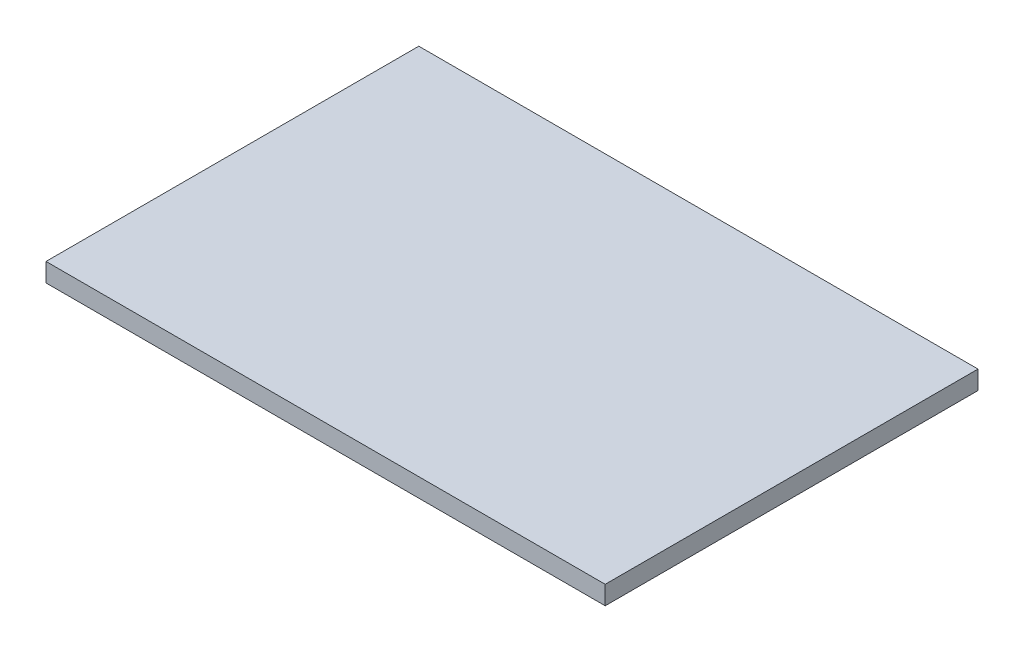
ISO-10303-21;
HEADER;
FILE_DESCRIPTION(('STEP AP214'),'2;1');
FILE_NAME('part.step','',(''),(''),'','','');
FILE_SCHEMA(('AUTOMOTIVE_DESIGN { 1 0 10303 214 1 1 1 1 }'));
ENDSEC;
DATA;
#1=APPLICATION_CONTEXT('core data for automotive mechanical design processes');
#2=APPLICATION_PROTOCOL_DEFINITION('international standard','automotive_design',2000,#1);
#3=PRODUCT_CONTEXT('',#1,'mechanical');
#4=PRODUCT('Part','Part','',(#3));
#5=PRODUCT_RELATED_PRODUCT_CATEGORY('part','',(#4));
#6=PRODUCT_DEFINITION_FORMATION('','',#4);
#7=PRODUCT_DEFINITION_CONTEXT('part definition',#1,'design');
#8=PRODUCT_DEFINITION('design','',#6,#7);
#9=PRODUCT_DEFINITION_SHAPE('','',#8);
#10=(LENGTH_UNIT() NAMED_UNIT(*) SI_UNIT(.MILLI.,.METRE.));
#11=(NAMED_UNIT(*) PLANE_ANGLE_UNIT() SI_UNIT($,.RADIAN.));
#12=(NAMED_UNIT(*) SI_UNIT($,.STERADIAN.) SOLID_ANGLE_UNIT());
#13=UNCERTAINTY_MEASURE_WITH_UNIT(LENGTH_MEASURE(1.E-05),#10,'distance_accuracy_value','');
#14=(GEOMETRIC_REPRESENTATION_CONTEXT(3) GLOBAL_UNCERTAINTY_ASSIGNED_CONTEXT((#13)) GLOBAL_UNIT_ASSIGNED_CONTEXT((#10,
#11,#12)) REPRESENTATION_CONTEXT('',''));
#15=CARTESIAN_POINT('',(0.,0.,0.));
#16=DIRECTION('',(0.,0.,1.));
#17=DIRECTION('',(1.,0.,0.));
#18=AXIS2_PLACEMENT_3D('',#15,#16,#17);
#19=CARTESIAN_POINT('',(0.,3.,0.));
#20=DIRECTION('',(1.,0.,0.));
#21=DIRECTION('',(0.,0.,-1.));
#22=AXIS2_PLACEMENT_3D('',#19,#20,#21);
#23=PLANE('',#22);
#24=DIRECTION('',(0.,0.,1.));
#25=VECTOR('',#24,1.);
#26=CARTESIAN_POINT('',(0.,0.,0.));
#27=LINE('',#26,#25);
#28=CARTESIAN_POINT('',(0.,0.,-60.));
#29=VERTEX_POINT('',#28);
#30=CARTESIAN_POINT('',(0.,0.,0.));
#31=VERTEX_POINT('',#30);
#32=EDGE_CURVE('E96',#29,#31,#27,.T.);
#33=ORIENTED_EDGE('',*,*,#32,.T.);
#34=DIRECTION('',(0.,-1.,0.));
#35=VECTOR('',#34,1.);
#36=CARTESIAN_POINT('',(0.,3.,0.));
#37=LINE('',#36,#35);
#38=CARTESIAN_POINT('',(0.,3.,0.));
#39=VERTEX_POINT('',#38);
#40=EDGE_CURVE('E11',#39,#31,#37,.T.);
#41=ORIENTED_EDGE('',*,*,#40,.F.);
#42=DIRECTION('',(0.,0.,1.));
#43=VECTOR('',#42,1.);
#44=CARTESIAN_POINT('',(0.,3.,0.));
#45=LINE('',#44,#43);
#46=CARTESIAN_POINT('',(0.,3.,-60.));
#47=VERTEX_POINT('',#46);
#48=EDGE_CURVE('E84',#47,#39,#45,.T.);
#49=ORIENTED_EDGE('',*,*,#48,.F.);
#50=DIRECTION('',(0.,-1.,0.));
#51=VECTOR('',#50,1.);
#52=CARTESIAN_POINT('',(0.,3.,-60.));
#53=LINE('',#52,#51);
#54=EDGE_CURVE('E92',#47,#29,#53,.T.);
#55=ORIENTED_EDGE('',*,*,#54,.T.);
#56=EDGE_LOOP('',(#33,#41,#49,#55));
#57=FACE_BOUND('',#56,.T.);
#58=ADVANCED_FACE('F33',(#57),#23,.F.);
#59=CARTESIAN_POINT('',(0.,3.,0.));
#60=DIRECTION('',(0.,0.,-1.));
#61=DIRECTION('',(-1.,0.,0.));
#62=AXIS2_PLACEMENT_3D('',#59,#60,#61);
#63=PLANE('',#62);
#64=DIRECTION('',(1.,0.,0.));
#65=VECTOR('',#64,1.);
#66=CARTESIAN_POINT('',(0.,0.,0.));
#67=LINE('',#66,#65);
#68=CARTESIAN_POINT('',(90.,0.,0.));
#69=VERTEX_POINT('',#68);
#70=EDGE_CURVE('E88',#31,#69,#67,.T.);
#71=ORIENTED_EDGE('',*,*,#70,.T.);
#72=DIRECTION('',(0.,-1.,0.));
#73=VECTOR('',#72,1.);
#74=CARTESIAN_POINT('',(90.,3.,0.));
#75=LINE('',#74,#73);
#76=CARTESIAN_POINT('',(90.,3.,0.));
#77=VERTEX_POINT('',#76);
#78=EDGE_CURVE('E41',#77,#69,#75,.T.);
#79=ORIENTED_EDGE('',*,*,#78,.F.);
#80=DIRECTION('',(1.,0.,0.));
#81=VECTOR('',#80,1.);
#82=CARTESIAN_POINT('',(0.,3.,0.));
#83=LINE('',#82,#81);
#84=EDGE_CURVE('E79',#39,#77,#83,.T.);
#85=ORIENTED_EDGE('',*,*,#84,.F.);
#86=ORIENTED_EDGE('',*,*,#40,.T.);
#87=EDGE_LOOP('',(#71,#79,#85,#86));
#88=FACE_BOUND('',#87,.T.);
#89=ADVANCED_FACE('F87',(#88),#63,.F.);
#90=CARTESIAN_POINT('',(90.,3.,0.));
#91=DIRECTION('',(-1.,0.,0.));
#92=DIRECTION('',(0.,0.,1.));
#93=AXIS2_PLACEMENT_3D('',#90,#91,#92);
#94=PLANE('',#93);
#95=DIRECTION('',(0.,0.,-1.));
#96=VECTOR('',#95,1.);
#97=CARTESIAN_POINT('',(90.,0.,0.));
#98=LINE('',#97,#96);
#99=CARTESIAN_POINT('',(90.,0.,-60.));
#100=VERTEX_POINT('',#99);
#101=EDGE_CURVE('E66',#69,#100,#98,.T.);
#102=ORIENTED_EDGE('',*,*,#101,.T.);
#103=DIRECTION('',(0.,-1.,0.));
#104=VECTOR('',#103,1.);
#105=CARTESIAN_POINT('',(90.,3.,-60.));
#106=LINE('',#105,#104);
#107=CARTESIAN_POINT('',(90.,3.,-60.));
#108=VERTEX_POINT('',#107);
#109=EDGE_CURVE('E89',#108,#100,#106,.T.);
#110=ORIENTED_EDGE('',*,*,#109,.F.);
#111=DIRECTION('',(0.,0.,-1.));
#112=VECTOR('',#111,1.);
#113=CARTESIAN_POINT('',(90.,3.,0.));
#114=LINE('',#113,#112);
#115=EDGE_CURVE('E82',#77,#108,#114,.T.);
#116=ORIENTED_EDGE('',*,*,#115,.F.);
#117=ORIENTED_EDGE('',*,*,#78,.T.);
#118=EDGE_LOOP('',(#102,#110,#116,#117));
#119=FACE_BOUND('',#118,.T.);
#120=ADVANCED_FACE('F90',(#119),#94,.F.);
#121=CARTESIAN_POINT('',(0.,3.,-60.));
#122=DIRECTION('',(0.,0.,1.));
#123=DIRECTION('',(1.,0.,0.));
#124=AXIS2_PLACEMENT_3D('',#121,#122,#123);
#125=PLANE('',#124);
#126=DIRECTION('',(-1.,0.,0.));
#127=VECTOR('',#126,1.);
#128=CARTESIAN_POINT('',(0.,0.,-60.));
#129=LINE('',#128,#127);
#130=EDGE_CURVE('E72',#100,#29,#129,.T.);
#131=ORIENTED_EDGE('',*,*,#130,.T.);
#132=ORIENTED_EDGE('',*,*,#54,.F.);
#133=DIRECTION('',(-1.,0.,0.));
#134=VECTOR('',#133,1.);
#135=CARTESIAN_POINT('',(0.,3.,-60.));
#136=LINE('',#135,#134);
#137=EDGE_CURVE('E49',#108,#47,#136,.T.);
#138=ORIENTED_EDGE('',*,*,#137,.F.);
#139=ORIENTED_EDGE('',*,*,#109,.T.);
#140=EDGE_LOOP('',(#131,#132,#138,#139));
#141=FACE_BOUND('',#140,.T.);
#142=ADVANCED_FACE('F103',(#141),#125,.F.);
#143=CARTESIAN_POINT('',(0.,3.,0.));
#144=DIRECTION('',(0.,-1.,0.));
#145=DIRECTION('',(0.,0.,-1.));
#146=AXIS2_PLACEMENT_3D('',#143,#144,#145);
#147=PLANE('',#146);
#148=ORIENTED_EDGE('',*,*,#48,.T.);
#149=ORIENTED_EDGE('',*,*,#84,.T.);
#150=ORIENTED_EDGE('',*,*,#115,.T.);
#151=ORIENTED_EDGE('',*,*,#137,.T.);
#152=EDGE_LOOP('',(#148,#149,#150,#151));
#153=FACE_BOUND('',#152,.T.);
#154=ADVANCED_FACE('F80',(#153),#147,.F.);
#155=CARTESIAN_POINT('',(0.,0.,0.));
#156=DIRECTION('',(0.,-1.,0.));
#157=DIRECTION('',(0.,0.,-1.));
#158=AXIS2_PLACEMENT_3D('',#155,#156,#157);
#159=PLANE('',#158);
#160=ORIENTED_EDGE('',*,*,#32,.F.);
#161=ORIENTED_EDGE('',*,*,#130,.F.);
#162=ORIENTED_EDGE('',*,*,#101,.F.);
#163=ORIENTED_EDGE('',*,*,#70,.F.);
#164=EDGE_LOOP('',(#160,#161,#162,#163));
#165=FACE_BOUND('',#164,.T.);
#166=ADVANCED_FACE('F106',(#165),#159,.T.);
#167=CLOSED_SHELL('',(#58,#89,#120,#142,#154,#166));
#168=MANIFOLD_SOLID_BREP('B2',#167);
#169=ADVANCED_BREP_SHAPE_REPRESENTATION('',(#18,#168),#14);
#170=SHAPE_DEFINITION_REPRESENTATION(#9,#169);
ENDSEC;
END-ISO-10303-21;
